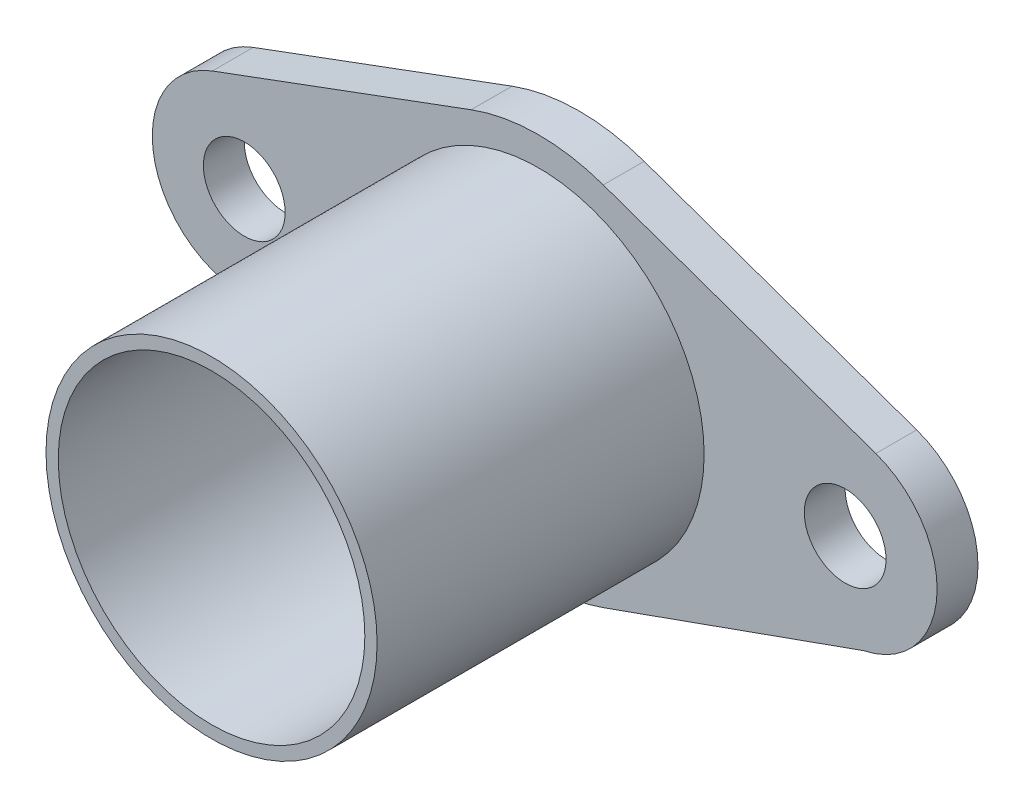
ISO-10303-21;
HEADER;
FILE_DESCRIPTION(('STEP AP214'),'2;1');
FILE_NAME('part.step','',(''),(''),'','','');
FILE_SCHEMA(('AUTOMOTIVE_DESIGN { 1 0 10303 214 1 1 1 1 }'));
ENDSEC;
DATA;
#1=APPLICATION_CONTEXT('core data for automotive mechanical design processes');
#2=APPLICATION_PROTOCOL_DEFINITION('international standard','automotive_design',2000,#1);
#3=PRODUCT_CONTEXT('',#1,'mechanical');
#4=PRODUCT('Part','Part','',(#3));
#5=PRODUCT_RELATED_PRODUCT_CATEGORY('part','',(#4));
#6=PRODUCT_DEFINITION_FORMATION('','',#4);
#7=PRODUCT_DEFINITION_CONTEXT('part definition',#1,'design');
#8=PRODUCT_DEFINITION('design','',#6,#7);
#9=PRODUCT_DEFINITION_SHAPE('','',#8);
#10=(LENGTH_UNIT() NAMED_UNIT(*) SI_UNIT(.MILLI.,.METRE.));
#11=(NAMED_UNIT(*) PLANE_ANGLE_UNIT() SI_UNIT($,.RADIAN.));
#12=(NAMED_UNIT(*) SI_UNIT($,.STERADIAN.) SOLID_ANGLE_UNIT());
#13=UNCERTAINTY_MEASURE_WITH_UNIT(LENGTH_MEASURE(1.E-05),#10,'distance_accuracy_value','');
#14=(GEOMETRIC_REPRESENTATION_CONTEXT(3) GLOBAL_UNCERTAINTY_ASSIGNED_CONTEXT((#13)) GLOBAL_UNIT_ASSIGNED_CONTEXT((#10,
#11,#12)) REPRESENTATION_CONTEXT('',''));
#15=CARTESIAN_POINT('',(0.,0.,0.));
#16=DIRECTION('',(0.,0.,1.));
#17=DIRECTION('',(1.,0.,0.));
#18=AXIS2_PLACEMENT_3D('',#15,#16,#17);
#19=CARTESIAN_POINT('',(-72.,0.,10.));
#20=DIRECTION('',(0.,0.,1.));
#21=DIRECTION('',(1.,0.,0.));
#22=AXIS2_PLACEMENT_3D('',#19,#20,#21);
#23=PLANE('',#22);
#24=CARTESIAN_POINT('',(75.,0.,10.));
#25=DIRECTION('',(0.,0.,1.));
#26=DIRECTION('',(1.,0.,0.));
#27=AXIS2_PLACEMENT_3D('',#24,#25,#26);
#28=CIRCLE('',#27,10.);
#29=CARTESIAN_POINT('',(85.,0.,10.));
#30=VERTEX_POINT('',#29);
#31=EDGE_CURVE('E217',#30,#30,#28,.T.);
#32=ORIENTED_EDGE('',*,*,#31,.F.);
#33=EDGE_LOOP('',(#32));
#34=FACE_BOUND('',#33,.T.);
#35=CARTESIAN_POINT('',(-72.,0.,10.));
#36=DIRECTION('',(0.,0.,1.));
#37=DIRECTION('',(1.,0.,0.));
#38=AXIS2_PLACEMENT_3D('',#35,#36,#37);
#39=CIRCLE('',#38,22.5);
#40=CARTESIAN_POINT('',(-79.8125,21.1001147804935,10.));
#41=VERTEX_POINT('',#40);
#42=CARTESIAN_POINT('',(-79.8125,-21.1001147804935,10.));
#43=VERTEX_POINT('',#42);
#44=EDGE_CURVE('E164',#41,#43,#39,.T.);
#45=ORIENTED_EDGE('',*,*,#44,.T.);
#46=DIRECTION('',(0.937782879133044,-0.347222222222223,0.));
#47=VECTOR('',#46,1.);
#48=CARTESIAN_POINT('',(-79.8125,-21.1001147804935,10.));
#49=LINE('',#48,#47);
#50=CARTESIAN_POINT('',(-16.4930555555556,-44.5446867588196,10.));
#51=VERTEX_POINT('',#50);
#52=EDGE_CURVE('E100',#43,#51,#49,.T.);
#53=ORIENTED_EDGE('',*,*,#52,.T.);
#54=CARTESIAN_POINT('',(0.,0.,10.));
#55=DIRECTION('',(0.,0.,1.));
#56=DIRECTION('',(1.,0.,0.));
#57=AXIS2_PLACEMENT_3D('',#54,#55,#56);
#58=CIRCLE('',#57,47.5);
#59=CARTESIAN_POINT('',(15.970417375307,-44.7347266545633,10.));
#60=VERTEX_POINT('',#59);
#61=EDGE_CURVE('E185',#51,#60,#58,.T.);
#62=ORIENTED_EDGE('',*,*,#61,.T.);
#63=DIRECTION('',(0.941783719043437,0.336219313164359,0.));
#64=VECTOR('',#63,1.);
#65=CARTESIAN_POINT('',(15.970417375307,-44.7347266545633,10.));
#66=LINE('',#65,#64);
#67=CARTESIAN_POINT('',(79.56,-22.0330751371659,10.));
#68=VERTEX_POINT('',#67);
#69=EDGE_CURVE('E199',#60,#68,#66,.T.);
#70=ORIENTED_EDGE('',*,*,#69,.T.);
#71=CARTESIAN_POINT('',(75.,0.,10.));
#72=DIRECTION('',(0.,0.,1.));
#73=DIRECTION('',(1.,0.,0.));
#74=AXIS2_PLACEMENT_3D('',#71,#72,#73);
#75=CIRCLE('',#74,22.5);
#76=CARTESIAN_POINT('',(82.5,21.2132034355964,10.));
#77=VERTEX_POINT('',#76);
#78=EDGE_CURVE('E119',#68,#77,#75,.T.);
#79=ORIENTED_EDGE('',*,*,#78,.T.);
#80=DIRECTION('',(-0.942809041582063,0.333333333333333,0.));
#81=VECTOR('',#80,1.);
#82=CARTESIAN_POINT('',(15.8333333333333,44.783429475148,10.));
#83=LINE('',#82,#81);
#84=CARTESIAN_POINT('',(15.8333333333333,44.783429475148,10.));
#85=VERTEX_POINT('',#84);
#86=EDGE_CURVE('E113',#77,#85,#83,.T.);
#87=ORIENTED_EDGE('',*,*,#86,.T.);
#88=CARTESIAN_POINT('',(0.,0.,10.));
#89=DIRECTION('',(0.,0.,1.));
#90=DIRECTION('',(1.,0.,0.));
#91=AXIS2_PLACEMENT_3D('',#88,#89,#90);
#92=CIRCLE('',#91,47.5);
#93=CARTESIAN_POINT('',(-16.4930555555556,44.5446867588196,10.));
#94=VERTEX_POINT('',#93);
#95=EDGE_CURVE('E117',#85,#94,#92,.T.);
#96=ORIENTED_EDGE('',*,*,#95,.T.);
#97=DIRECTION('',(-0.937782879133044,-0.347222222222222,0.));
#98=VECTOR('',#97,1.);
#99=CARTESIAN_POINT('',(-79.8125,21.1001147804935,10.));
#100=LINE('',#99,#98);
#101=EDGE_CURVE('E57',#94,#41,#100,.T.);
#102=ORIENTED_EDGE('',*,*,#101,.T.);
#103=EDGE_LOOP('',(#45,#53,#62,#70,#79,#87,#96,#102));
#104=FACE_BOUND('',#103,.T.);
#105=CARTESIAN_POINT('',(-72.,0.,10.));
#106=DIRECTION('',(0.,0.,1.));
#107=DIRECTION('',(1.,0.,0.));
#108=AXIS2_PLACEMENT_3D('',#105,#106,#107);
#109=CIRCLE('',#108,9.99999999999999);
#110=CARTESIAN_POINT('',(-62.,0.,10.));
#111=VERTEX_POINT('',#110);
#112=EDGE_CURVE('E212',#111,#111,#109,.T.);
#113=ORIENTED_EDGE('',*,*,#112,.F.);
#114=EDGE_LOOP('',(#113));
#115=FACE_BOUND('',#114,.T.);
#116=CARTESIAN_POINT('',(0.,0.,10.));
#117=DIRECTION('',(0.,0.,1.));
#118=DIRECTION('',(1.,0.,0.));
#119=AXIS2_PLACEMENT_3D('',#116,#117,#118);
#120=CIRCLE('',#119,40.5);
#121=CARTESIAN_POINT('',(40.5,0.,10.));
#122=VERTEX_POINT('',#121);
#123=EDGE_CURVE('E229',#122,#122,#120,.T.);
#124=ORIENTED_EDGE('',*,*,#123,.F.);
#125=EDGE_LOOP('',(#124));
#126=FACE_BOUND('',#125,.T.);
#127=ADVANCED_FACE('F39',(#34,#104,#115,#126),#23,.T.);
#128=CARTESIAN_POINT('',(-72.,0.,0.));
#129=DIRECTION('',(0.,0.,1.));
#130=DIRECTION('',(1.,0.,0.));
#131=AXIS2_PLACEMENT_3D('',#128,#129,#130);
#132=PLANE('',#131);
#133=CARTESIAN_POINT('',(-72.,0.,0.));
#134=DIRECTION('',(0.,0.,1.));
#135=DIRECTION('',(1.,0.,0.));
#136=AXIS2_PLACEMENT_3D('',#133,#134,#135);
#137=CIRCLE('',#136,22.5);
#138=CARTESIAN_POINT('',(-79.8125,21.1001147804935,0.));
#139=VERTEX_POINT('',#138);
#140=CARTESIAN_POINT('',(-79.8125,-21.1001147804935,0.));
#141=VERTEX_POINT('',#140);
#142=EDGE_CURVE('E141',#139,#141,#137,.T.);
#143=ORIENTED_EDGE('',*,*,#142,.F.);
#144=DIRECTION('',(-0.937782879133044,-0.347222222222222,0.));
#145=VECTOR('',#144,1.);
#146=CARTESIAN_POINT('',(-79.8125,21.1001147804935,0.));
#147=LINE('',#146,#145);
#148=CARTESIAN_POINT('',(-16.4930555555556,44.5446867588196,0.));
#149=VERTEX_POINT('',#148);
#150=EDGE_CURVE('E92',#149,#139,#147,.T.);
#151=ORIENTED_EDGE('',*,*,#150,.F.);
#152=CARTESIAN_POINT('',(0.,0.,0.));
#153=DIRECTION('',(0.,0.,1.));
#154=DIRECTION('',(1.,0.,0.));
#155=AXIS2_PLACEMENT_3D('',#152,#153,#154);
#156=CIRCLE('',#155,47.5);
#157=CARTESIAN_POINT('',(15.8333333333333,44.783429475148,0.));
#158=VERTEX_POINT('',#157);
#159=EDGE_CURVE('E86',#158,#149,#156,.T.);
#160=ORIENTED_EDGE('',*,*,#159,.F.);
#161=DIRECTION('',(-0.942809041582063,0.333333333333333,0.));
#162=VECTOR('',#161,1.);
#163=CARTESIAN_POINT('',(15.8333333333333,44.783429475148,0.));
#164=LINE('',#163,#162);
#165=CARTESIAN_POINT('',(82.5,21.2132034355964,0.));
#166=VERTEX_POINT('',#165);
#167=EDGE_CURVE('E128',#166,#158,#164,.T.);
#168=ORIENTED_EDGE('',*,*,#167,.F.);
#169=CARTESIAN_POINT('',(75.,0.,0.));
#170=DIRECTION('',(0.,0.,1.));
#171=DIRECTION('',(1.,0.,0.));
#172=AXIS2_PLACEMENT_3D('',#169,#170,#171);
#173=CIRCLE('',#172,22.5);
#174=CARTESIAN_POINT('',(79.56,-22.0330751371659,0.));
#175=VERTEX_POINT('',#174);
#176=EDGE_CURVE('E155',#175,#166,#173,.T.);
#177=ORIENTED_EDGE('',*,*,#176,.F.);
#178=DIRECTION('',(0.941783719043437,0.336219313164359,0.));
#179=VECTOR('',#178,1.);
#180=CARTESIAN_POINT('',(15.970417375307,-44.7347266545633,0.));
#181=LINE('',#180,#179);
#182=CARTESIAN_POINT('',(15.970417375307,-44.7347266545633,0.));
#183=VERTEX_POINT('',#182);
#184=EDGE_CURVE('E152',#183,#175,#181,.T.);
#185=ORIENTED_EDGE('',*,*,#184,.F.);
#186=CARTESIAN_POINT('',(0.,0.,0.));
#187=DIRECTION('',(0.,0.,1.));
#188=DIRECTION('',(1.,0.,0.));
#189=AXIS2_PLACEMENT_3D('',#186,#187,#188);
#190=CIRCLE('',#189,47.5);
#191=CARTESIAN_POINT('',(-16.4930555555556,-44.5446867588196,0.));
#192=VERTEX_POINT('',#191);
#193=EDGE_CURVE('E149',#192,#183,#190,.T.);
#194=ORIENTED_EDGE('',*,*,#193,.F.);
#195=DIRECTION('',(0.937782879133044,-0.347222222222223,0.));
#196=VECTOR('',#195,1.);
#197=CARTESIAN_POINT('',(-79.8125,-21.1001147804935,0.));
#198=LINE('',#197,#196);
#199=EDGE_CURVE('E145',#141,#192,#198,.T.);
#200=ORIENTED_EDGE('',*,*,#199,.F.);
#201=EDGE_LOOP('',(#143,#151,#160,#168,#177,#185,#194,#200));
#202=FACE_BOUND('',#201,.T.);
#203=CARTESIAN_POINT('',(0.,0.,0.));
#204=DIRECTION('',(0.,0.,1.));
#205=DIRECTION('',(1.,0.,0.));
#206=AXIS2_PLACEMENT_3D('',#203,#204,#205);
#207=CIRCLE('',#206,37.5);
#208=CARTESIAN_POINT('',(37.5,0.,0.));
#209=VERTEX_POINT('',#208);
#210=EDGE_CURVE('E146',#209,#209,#207,.T.);
#211=ORIENTED_EDGE('',*,*,#210,.T.);
#212=EDGE_LOOP('',(#211));
#213=FACE_BOUND('',#212,.T.);
#214=CARTESIAN_POINT('',(-72.,0.,0.));
#215=DIRECTION('',(0.,0.,1.));
#216=DIRECTION('',(1.,0.,0.));
#217=AXIS2_PLACEMENT_3D('',#214,#215,#216);
#218=CIRCLE('',#217,9.99999999999999);
#219=CARTESIAN_POINT('',(-62.,0.,0.));
#220=VERTEX_POINT('',#219);
#221=EDGE_CURVE('E213',#220,#220,#218,.T.);
#222=ORIENTED_EDGE('',*,*,#221,.T.);
#223=EDGE_LOOP('',(#222));
#224=FACE_BOUND('',#223,.T.);
#225=CARTESIAN_POINT('',(75.,0.,0.));
#226=DIRECTION('',(0.,0.,1.));
#227=DIRECTION('',(1.,0.,0.));
#228=AXIS2_PLACEMENT_3D('',#225,#226,#227);
#229=CIRCLE('',#228,10.);
#230=CARTESIAN_POINT('',(85.,0.,0.));
#231=VERTEX_POINT('',#230);
#232=EDGE_CURVE('E221',#231,#231,#229,.T.);
#233=ORIENTED_EDGE('',*,*,#232,.T.);
#234=EDGE_LOOP('',(#233));
#235=FACE_BOUND('',#234,.T.);
#236=ADVANCED_FACE('F189',(#202,#213,#224,#235),#132,.F.);
#237=CARTESIAN_POINT('',(-72.,0.,10.));
#238=DIRECTION('',(0.,0.,-1.));
#239=DIRECTION('',(-1.,0.,0.));
#240=AXIS2_PLACEMENT_3D('',#237,#238,#239);
#241=CYLINDRICAL_SURFACE('',#240,22.5);
#242=ORIENTED_EDGE('',*,*,#142,.T.);
#243=DIRECTION('',(0.,0.,-1.));
#244=VECTOR('',#243,1.);
#245=CARTESIAN_POINT('',(-79.8125,-21.1001147804935,10.));
#246=LINE('',#245,#244);
#247=EDGE_CURVE('E11',#43,#141,#246,.T.);
#248=ORIENTED_EDGE('',*,*,#247,.F.);
#249=ORIENTED_EDGE('',*,*,#44,.F.);
#250=DIRECTION('',(0.,0.,-1.));
#251=VECTOR('',#250,1.);
#252=CARTESIAN_POINT('',(-79.8125,21.1001147804935,10.));
#253=LINE('',#252,#251);
#254=EDGE_CURVE('E137',#41,#139,#253,.T.);
#255=ORIENTED_EDGE('',*,*,#254,.T.);
#256=EDGE_LOOP('',(#242,#248,#249,#255));
#257=FACE_BOUND('',#256,.T.);
#258=ADVANCED_FACE('F41',(#257),#241,.T.);
#259=CARTESIAN_POINT('',(-79.8125,-21.1001147804935,10.));
#260=DIRECTION('',(0.347222222222223,0.937782879133044,0.));
#261=DIRECTION('',(-0.937782879133044,0.347222222222223,0.));
#262=AXIS2_PLACEMENT_3D('',#259,#260,#261);
#263=PLANE('',#262);
#264=ORIENTED_EDGE('',*,*,#199,.T.);
#265=DIRECTION('',(0.,0.,-1.));
#266=VECTOR('',#265,1.);
#267=CARTESIAN_POINT('',(-16.4930555555556,-44.5446867588196,10.));
#268=LINE('',#267,#266);
#269=EDGE_CURVE('E49',#51,#192,#268,.T.);
#270=ORIENTED_EDGE('',*,*,#269,.F.);
#271=ORIENTED_EDGE('',*,*,#52,.F.);
#272=ORIENTED_EDGE('',*,*,#247,.T.);
#273=EDGE_LOOP('',(#264,#270,#271,#272));
#274=FACE_BOUND('',#273,.T.);
#275=ADVANCED_FACE('F284',(#274),#263,.F.);
#276=CARTESIAN_POINT('',(0.,0.,10.));
#277=DIRECTION('',(0.,0.,-1.));
#278=DIRECTION('',(-1.,0.,0.));
#279=AXIS2_PLACEMENT_3D('',#276,#277,#278);
#280=CYLINDRICAL_SURFACE('',#279,47.5);
#281=ORIENTED_EDGE('',*,*,#193,.T.);
#282=DIRECTION('',(0.,0.,-1.));
#283=VECTOR('',#282,1.);
#284=CARTESIAN_POINT('',(15.970417375307,-44.7347266545633,10.));
#285=LINE('',#284,#283);
#286=EDGE_CURVE('E175',#60,#183,#285,.T.);
#287=ORIENTED_EDGE('',*,*,#286,.F.);
#288=ORIENTED_EDGE('',*,*,#61,.F.);
#289=ORIENTED_EDGE('',*,*,#269,.T.);
#290=EDGE_LOOP('',(#281,#287,#288,#289));
#291=FACE_BOUND('',#290,.T.);
#292=ADVANCED_FACE('F183',(#291),#280,.T.);
#293=CARTESIAN_POINT('',(15.970417375307,-44.7347266545633,10.));
#294=DIRECTION('',(-0.336219313164359,0.941783719043437,0.));
#295=DIRECTION('',(-0.941783719043437,-0.336219313164359,0.));
#296=AXIS2_PLACEMENT_3D('',#293,#294,#295);
#297=PLANE('',#296);
#298=ORIENTED_EDGE('',*,*,#184,.T.);
#299=DIRECTION('',(0.,0.,-1.));
#300=VECTOR('',#299,1.);
#301=CARTESIAN_POINT('',(79.56,-22.0330751371659,10.));
#302=LINE('',#301,#300);
#303=EDGE_CURVE('E171',#68,#175,#302,.T.);
#304=ORIENTED_EDGE('',*,*,#303,.F.);
#305=ORIENTED_EDGE('',*,*,#69,.F.);
#306=ORIENTED_EDGE('',*,*,#286,.T.);
#307=EDGE_LOOP('',(#298,#304,#305,#306));
#308=FACE_BOUND('',#307,.T.);
#309=ADVANCED_FACE('F194',(#308),#297,.F.);
#310=CARTESIAN_POINT('',(75.,0.,10.));
#311=DIRECTION('',(0.,0.,-1.));
#312=DIRECTION('',(-1.,0.,0.));
#313=AXIS2_PLACEMENT_3D('',#310,#311,#312);
#314=CYLINDRICAL_SURFACE('',#313,22.5);
#315=ORIENTED_EDGE('',*,*,#176,.T.);
#316=DIRECTION('',(0.,0.,-1.));
#317=VECTOR('',#316,1.);
#318=CARTESIAN_POINT('',(82.5,21.2132034355964,10.));
#319=LINE('',#318,#317);
#320=EDGE_CURVE('E130',#77,#166,#319,.T.);
#321=ORIENTED_EDGE('',*,*,#320,.F.);
#322=ORIENTED_EDGE('',*,*,#78,.F.);
#323=ORIENTED_EDGE('',*,*,#303,.T.);
#324=EDGE_LOOP('',(#315,#321,#322,#323));
#325=FACE_BOUND('',#324,.T.);
#326=ADVANCED_FACE('F197',(#325),#314,.T.);
#327=CARTESIAN_POINT('',(15.8333333333333,44.783429475148,10.));
#328=DIRECTION('',(-0.333333333333333,-0.942809041582063,0.));
#329=DIRECTION('',(0.942809041582063,-0.333333333333333,0.));
#330=AXIS2_PLACEMENT_3D('',#327,#328,#329);
#331=PLANE('',#330);
#332=ORIENTED_EDGE('',*,*,#167,.T.);
#333=DIRECTION('',(0.,0.,-1.));
#334=VECTOR('',#333,1.);
#335=CARTESIAN_POINT('',(15.8333333333333,44.783429475148,10.));
#336=LINE('',#335,#334);
#337=EDGE_CURVE('E125',#85,#158,#336,.T.);
#338=ORIENTED_EDGE('',*,*,#337,.F.);
#339=ORIENTED_EDGE('',*,*,#86,.F.);
#340=ORIENTED_EDGE('',*,*,#320,.T.);
#341=EDGE_LOOP('',(#332,#338,#339,#340));
#342=FACE_BOUND('',#341,.T.);
#343=ADVANCED_FACE('F126',(#342),#331,.F.);
#344=CARTESIAN_POINT('',(0.,0.,10.));
#345=DIRECTION('',(0.,0.,-1.));
#346=DIRECTION('',(-1.,0.,0.));
#347=AXIS2_PLACEMENT_3D('',#344,#345,#346);
#348=CYLINDRICAL_SURFACE('',#347,47.5);
#349=ORIENTED_EDGE('',*,*,#159,.T.);
#350=DIRECTION('',(0.,0.,-1.));
#351=VECTOR('',#350,1.);
#352=CARTESIAN_POINT('',(-16.4930555555556,44.5446867588196,10.));
#353=LINE('',#352,#351);
#354=EDGE_CURVE('E131',#94,#149,#353,.T.);
#355=ORIENTED_EDGE('',*,*,#354,.F.);
#356=ORIENTED_EDGE('',*,*,#95,.F.);
#357=ORIENTED_EDGE('',*,*,#337,.T.);
#358=EDGE_LOOP('',(#349,#355,#356,#357));
#359=FACE_BOUND('',#358,.T.);
#360=ADVANCED_FACE('F133',(#359),#348,.T.);
#361=CARTESIAN_POINT('',(-79.8125,21.1001147804935,10.));
#362=DIRECTION('',(0.347222222222222,-0.937782879133044,0.));
#363=DIRECTION('',(0.937782879133044,0.347222222222222,0.));
#364=AXIS2_PLACEMENT_3D('',#361,#362,#363);
#365=PLANE('',#364);
#366=ORIENTED_EDGE('',*,*,#150,.T.);
#367=ORIENTED_EDGE('',*,*,#254,.F.);
#368=ORIENTED_EDGE('',*,*,#101,.F.);
#369=ORIENTED_EDGE('',*,*,#354,.T.);
#370=EDGE_LOOP('',(#366,#367,#368,#369));
#371=FACE_BOUND('',#370,.T.);
#372=ADVANCED_FACE('F272',(#371),#365,.F.);
#373=CARTESIAN_POINT('',(0.,0.,10.));
#374=DIRECTION('',(0.,0.,-1.));
#375=DIRECTION('',(-1.,0.,0.));
#376=AXIS2_PLACEMENT_3D('',#373,#374,#375);
#377=CYLINDRICAL_SURFACE('',#376,37.5);
#378=ORIENTED_EDGE('',*,*,#210,.F.);
#379=EDGE_LOOP('',(#378));
#380=FACE_BOUND('',#379,.T.);
#381=CARTESIAN_POINT('',(0.,0.,90.));
#382=DIRECTION('',(0.,0.,1.));
#383=DIRECTION('',(1.,0.,0.));
#384=AXIS2_PLACEMENT_3D('',#381,#382,#383);
#385=CIRCLE('',#384,37.5);
#386=CARTESIAN_POINT('',(37.5,0.,90.));
#387=VERTEX_POINT('',#386);
#388=EDGE_CURVE('E233',#387,#387,#385,.T.);
#389=ORIENTED_EDGE('',*,*,#388,.T.);
#390=EDGE_LOOP('',(#389));
#391=FACE_BOUND('',#390,.T.);
#392=ADVANCED_FACE('F241',(#380,#391),#377,.F.);
#393=CARTESIAN_POINT('',(-72.,0.,10.));
#394=DIRECTION('',(0.,0.,-1.));
#395=DIRECTION('',(-1.,0.,0.));
#396=AXIS2_PLACEMENT_3D('',#393,#394,#395);
#397=CYLINDRICAL_SURFACE('',#396,9.99999999999999);
#398=ORIENTED_EDGE('',*,*,#112,.T.);
#399=EDGE_LOOP('',(#398));
#400=FACE_BOUND('',#399,.T.);
#401=ORIENTED_EDGE('',*,*,#221,.F.);
#402=EDGE_LOOP('',(#401));
#403=FACE_BOUND('',#402,.T.);
#404=ADVANCED_FACE('F256',(#400,#403),#397,.F.);
#405=CARTESIAN_POINT('',(75.,0.,10.));
#406=DIRECTION('',(0.,0.,-1.));
#407=DIRECTION('',(-1.,0.,0.));
#408=AXIS2_PLACEMENT_3D('',#405,#406,#407);
#409=CYLINDRICAL_SURFACE('',#408,10.);
#410=ORIENTED_EDGE('',*,*,#31,.T.);
#411=EDGE_LOOP('',(#410));
#412=FACE_BOUND('',#411,.T.);
#413=ORIENTED_EDGE('',*,*,#232,.F.);
#414=EDGE_LOOP('',(#413));
#415=FACE_BOUND('',#414,.T.);
#416=ADVANCED_FACE('F246',(#412,#415),#409,.F.);
#417=CARTESIAN_POINT('',(0.,0.,90.));
#418=DIRECTION('',(0.,0.,1.));
#419=DIRECTION('',(1.,0.,0.));
#420=AXIS2_PLACEMENT_3D('',#417,#418,#419);
#421=PLANE('',#420);
#422=CARTESIAN_POINT('',(0.,0.,90.));
#423=DIRECTION('',(0.,0.,1.));
#424=DIRECTION('',(1.,0.,0.));
#425=AXIS2_PLACEMENT_3D('',#422,#423,#424);
#426=CIRCLE('',#425,40.5);
#427=CARTESIAN_POINT('',(40.5,0.,90.));
#428=VERTEX_POINT('',#427);
#429=EDGE_CURVE('E225',#428,#428,#426,.T.);
#430=ORIENTED_EDGE('',*,*,#429,.T.);
#431=EDGE_LOOP('',(#430));
#432=FACE_BOUND('',#431,.T.);
#433=ORIENTED_EDGE('',*,*,#388,.F.);
#434=EDGE_LOOP('',(#433));
#435=FACE_BOUND('',#434,.T.);
#436=ADVANCED_FACE('F243',(#432,#435),#421,.T.);
#437=CARTESIAN_POINT('',(0.,0.,90.));
#438=DIRECTION('',(0.,0.,-1.));
#439=DIRECTION('',(-1.,0.,0.));
#440=AXIS2_PLACEMENT_3D('',#437,#438,#439);
#441=CYLINDRICAL_SURFACE('',#440,40.5);
#442=ORIENTED_EDGE('',*,*,#429,.F.);
#443=EDGE_LOOP('',(#442));
#444=FACE_BOUND('',#443,.T.);
#445=ORIENTED_EDGE('',*,*,#123,.T.);
#446=EDGE_LOOP('',(#445));
#447=FACE_BOUND('',#446,.T.);
#448=ADVANCED_FACE('F245',(#444,#447),#441,.T.);
#449=CLOSED_SHELL('',(#127,#236,#258,#275,#292,#309,#326,#343,#360,#372,#392,#404,#416,#436,#448));
#450=MANIFOLD_SOLID_BREP('B2',#449);
#451=ADVANCED_BREP_SHAPE_REPRESENTATION('',(#18,#450),#14);
#452=SHAPE_DEFINITION_REPRESENTATION(#9,#451);
ENDSEC;
END-ISO-10303-21;
